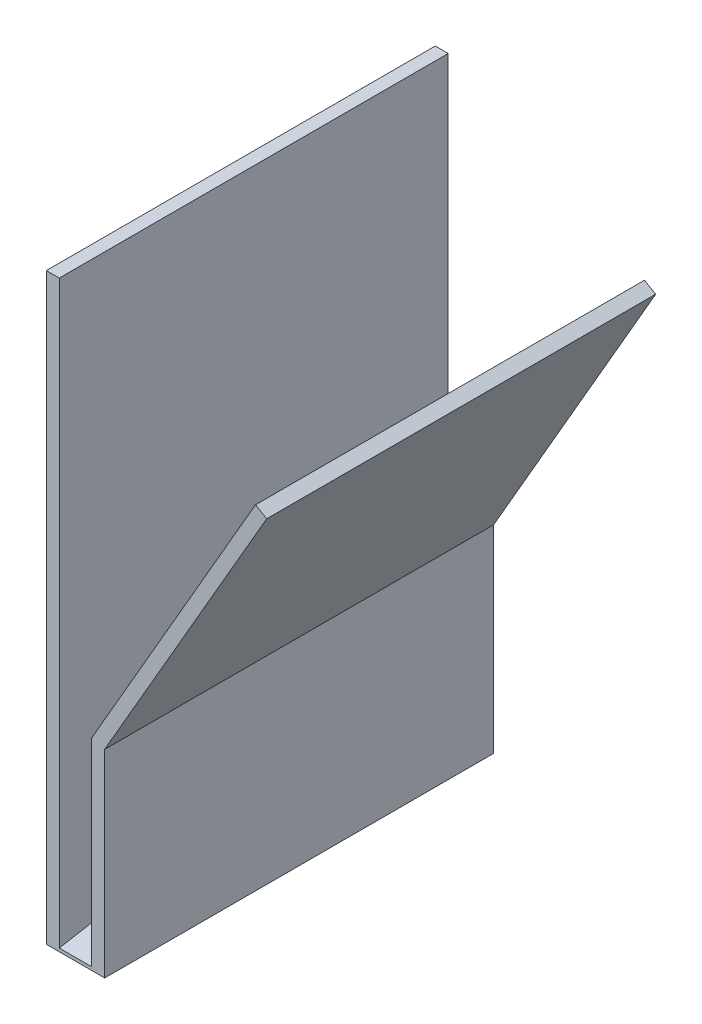
ISO-10303-21;
HEADER;
FILE_DESCRIPTION(('STEP AP214'),'2;1');
FILE_NAME('part.step','',(''),(''),'','','');
FILE_SCHEMA(('AUTOMOTIVE_DESIGN { 1 0 10303 214 1 1 1 1 }'));
ENDSEC;
DATA;
#1=APPLICATION_CONTEXT('core data for automotive mechanical design processes');
#2=APPLICATION_PROTOCOL_DEFINITION('international standard','automotive_design',2000,#1);
#3=PRODUCT_CONTEXT('',#1,'mechanical');
#4=PRODUCT('Part','Part','',(#3));
#5=PRODUCT_RELATED_PRODUCT_CATEGORY('part','',(#4));
#6=PRODUCT_DEFINITION_FORMATION('','',#4);
#7=PRODUCT_DEFINITION_CONTEXT('part definition',#1,'design');
#8=PRODUCT_DEFINITION('design','',#6,#7);
#9=PRODUCT_DEFINITION_SHAPE('','',#8);
#10=(LENGTH_UNIT() NAMED_UNIT(*) SI_UNIT(.MILLI.,.METRE.));
#11=(NAMED_UNIT(*) PLANE_ANGLE_UNIT() SI_UNIT($,.RADIAN.));
#12=(NAMED_UNIT(*) SI_UNIT($,.STERADIAN.) SOLID_ANGLE_UNIT());
#13=UNCERTAINTY_MEASURE_WITH_UNIT(LENGTH_MEASURE(1.E-05),#10,'distance_accuracy_value','');
#14=(GEOMETRIC_REPRESENTATION_CONTEXT(3) GLOBAL_UNCERTAINTY_ASSIGNED_CONTEXT((#13)) GLOBAL_UNIT_ASSIGNED_CONTEXT((#10,
#11,#12)) REPRESENTATION_CONTEXT('',''));
#15=CARTESIAN_POINT('',(0.,0.,0.));
#16=DIRECTION('',(0.,0.,1.));
#17=DIRECTION('',(1.,0.,0.));
#18=AXIS2_PLACEMENT_3D('',#15,#16,#17);
#19=CARTESIAN_POINT('',(4.,0.,120.));
#20=DIRECTION('',(-1.,0.,0.));
#21=DIRECTION('',(0.,0.,1.));
#22=AXIS2_PLACEMENT_3D('',#19,#20,#21);
#23=PLANE('',#22);
#24=DIRECTION('',(0.,-0.173648177666924,0.984807753012209));
#25=VECTOR('',#24,1.);
#26=CARTESIAN_POINT('',(4.,1.,120.));
#27=LINE('',#26,#25);
#28=CARTESIAN_POINT('',(4.,22.159237685015,0.));
#29=VERTEX_POINT('',#28);
#30=CARTESIAN_POINT('',(4.,1.,120.));
#31=VERTEX_POINT('',#30);
#32=EDGE_CURVE('E54',#29,#31,#27,.T.);
#33=ORIENTED_EDGE('',*,*,#32,.F.);
#34=DIRECTION('',(0.,1.,0.));
#35=VECTOR('',#34,1.);
#36=CARTESIAN_POINT('',(4.,0.,0.));
#37=LINE('',#36,#35);
#38=CARTESIAN_POINT('',(4.,180.,0.));
#39=VERTEX_POINT('',#38);
#40=EDGE_CURVE('E192',#29,#39,#37,.T.);
#41=ORIENTED_EDGE('',*,*,#40,.T.);
#42=DIRECTION('',(0.,0.,-1.));
#43=VECTOR('',#42,1.);
#44=CARTESIAN_POINT('',(4.,180.,120.));
#45=LINE('',#44,#43);
#46=CARTESIAN_POINT('',(4.,180.,120.));
#47=VERTEX_POINT('',#46);
#48=EDGE_CURVE('E47',#47,#39,#45,.T.);
#49=ORIENTED_EDGE('',*,*,#48,.F.);
#50=DIRECTION('',(0.,1.,0.));
#51=VECTOR('',#50,1.);
#52=CARTESIAN_POINT('',(4.,0.,120.));
#53=LINE('',#52,#51);
#54=EDGE_CURVE('E184',#31,#47,#53,.T.);
#55=ORIENTED_EDGE('',*,*,#54,.F.);
#56=EDGE_LOOP('',(#33,#41,#49,#55));
#57=FACE_BOUND('',#56,.T.);
#58=ADVANCED_FACE('F39',(#57),#23,.F.);
#59=CARTESIAN_POINT('',(0.,0.,120.));
#60=DIRECTION('',(1.,0.,0.));
#61=DIRECTION('',(0.,0.,-1.));
#62=AXIS2_PLACEMENT_3D('',#59,#60,#61);
#63=PLANE('',#62);
#64=DIRECTION('',(0.,-1.,0.));
#65=VECTOR('',#64,1.);
#66=CARTESIAN_POINT('',(0.,0.,0.));
#67=LINE('',#66,#65);
#68=CARTESIAN_POINT('',(0.,180.,0.));
#69=VERTEX_POINT('',#68);
#70=CARTESIAN_POINT('',(0.,0.,0.));
#71=VERTEX_POINT('',#70);
#72=EDGE_CURVE('E180',#69,#71,#67,.T.);
#73=ORIENTED_EDGE('',*,*,#72,.T.);
#74=DIRECTION('',(0.,0.,-1.));
#75=VECTOR('',#74,1.);
#76=CARTESIAN_POINT('',(0.,0.,120.));
#77=LINE('',#76,#75);
#78=CARTESIAN_POINT('',(0.,0.,120.));
#79=VERTEX_POINT('',#78);
#80=EDGE_CURVE('E11',#79,#71,#77,.T.);
#81=ORIENTED_EDGE('',*,*,#80,.F.);
#82=DIRECTION('',(0.,-1.,0.));
#83=VECTOR('',#82,1.);
#84=CARTESIAN_POINT('',(0.,0.,120.));
#85=LINE('',#84,#83);
#86=CARTESIAN_POINT('',(0.,180.,120.));
#87=VERTEX_POINT('',#86);
#88=EDGE_CURVE('E181',#87,#79,#85,.T.);
#89=ORIENTED_EDGE('',*,*,#88,.F.);
#90=DIRECTION('',(0.,0.,-1.));
#91=VECTOR('',#90,1.);
#92=CARTESIAN_POINT('',(0.,180.,120.));
#93=LINE('',#92,#91);
#94=EDGE_CURVE('E187',#87,#69,#93,.T.);
#95=ORIENTED_EDGE('',*,*,#94,.T.);
#96=EDGE_LOOP('',(#73,#81,#89,#95));
#97=FACE_BOUND('',#96,.T.);
#98=ADVANCED_FACE('F41',(#97),#63,.F.);
#99=CARTESIAN_POINT('',(0.,0.,120.));
#100=DIRECTION('',(0.,1.,0.));
#101=DIRECTION('',(0.,0.,1.));
#102=AXIS2_PLACEMENT_3D('',#99,#100,#101);
#103=PLANE('',#102);
#104=DIRECTION('',(1.,0.,0.));
#105=VECTOR('',#104,1.);
#106=CARTESIAN_POINT('',(0.,0.,0.));
#107=LINE('',#106,#105);
#108=CARTESIAN_POINT('',(18.,0.,0.));
#109=VERTEX_POINT('',#108);
#110=EDGE_CURVE('E190',#71,#109,#107,.T.);
#111=ORIENTED_EDGE('',*,*,#110,.T.);
#112=DIRECTION('',(0.,0.,-1.));
#113=VECTOR('',#112,1.);
#114=CARTESIAN_POINT('',(18.,0.,279.132305016042));
#115=LINE('',#114,#113);
#116=CARTESIAN_POINT('',(18.,0.,120.));
#117=VERTEX_POINT('',#116);
#118=EDGE_CURVE('E162',#117,#109,#115,.T.);
#119=ORIENTED_EDGE('',*,*,#118,.F.);
#120=DIRECTION('',(1.,0.,0.));
#121=VECTOR('',#120,1.);
#122=CARTESIAN_POINT('',(0.,0.,120.));
#123=LINE('',#122,#121);
#124=EDGE_CURVE('E85',#79,#117,#123,.T.);
#125=ORIENTED_EDGE('',*,*,#124,.F.);
#126=ORIENTED_EDGE('',*,*,#80,.T.);
#127=EDGE_LOOP('',(#111,#119,#125,#126));
#128=FACE_BOUND('',#127,.T.);
#129=ADVANCED_FACE('F208',(#128),#103,.F.);
#130=CARTESIAN_POINT('',(0.,180.,120.));
#131=DIRECTION('',(0.,-1.,0.));
#132=DIRECTION('',(0.,0.,-1.));
#133=AXIS2_PLACEMENT_3D('',#130,#131,#132);
#134=PLANE('',#133);
#135=DIRECTION('',(-1.,0.,0.));
#136=VECTOR('',#135,1.);
#137=CARTESIAN_POINT('',(0.,180.,0.));
#138=LINE('',#137,#136);
#139=EDGE_CURVE('E79',#39,#69,#138,.T.);
#140=ORIENTED_EDGE('',*,*,#139,.T.);
#141=ORIENTED_EDGE('',*,*,#94,.F.);
#142=DIRECTION('',(-1.,0.,0.));
#143=VECTOR('',#142,1.);
#144=CARTESIAN_POINT('',(0.,180.,120.));
#145=LINE('',#144,#143);
#146=EDGE_CURVE('E63',#47,#87,#145,.T.);
#147=ORIENTED_EDGE('',*,*,#146,.F.);
#148=ORIENTED_EDGE('',*,*,#48,.T.);
#149=EDGE_LOOP('',(#140,#141,#147,#148));
#150=FACE_BOUND('',#149,.T.);
#151=ADVANCED_FACE('F196',(#150),#134,.F.);
#152=CARTESIAN_POINT('',(0.,0.,120.));
#153=DIRECTION('',(0.,0.,-1.));
#154=DIRECTION('',(-1.,0.,0.));
#155=AXIS2_PLACEMENT_3D('',#152,#153,#154);
#156=PLANE('',#155);
#157=ORIENTED_EDGE('',*,*,#88,.T.);
#158=ORIENTED_EDGE('',*,*,#124,.T.);
#159=DIRECTION('',(0.,1.,0.));
#160=VECTOR('',#159,1.);
#161=CARTESIAN_POINT('',(18.,61.0874409152905,120.));
#162=LINE('',#161,#160);
#163=CARTESIAN_POINT('',(18.,61.0874409152905,120.));
#164=VERTEX_POINT('',#163);
#165=EDGE_CURVE('E172',#117,#164,#162,.T.);
#166=ORIENTED_EDGE('',*,*,#165,.T.);
#167=DIRECTION('',(0.500000000000001,0.866025403784438,0.));
#168=VECTOR('',#167,1.);
#169=CARTESIAN_POINT('',(68.0000000000001,147.689981293734,120.));
#170=LINE('',#169,#168);
#171=CARTESIAN_POINT('',(68.0000000000001,147.689981293734,120.));
#172=VERTEX_POINT('',#171);
#173=EDGE_CURVE('E207',#164,#172,#170,.T.);
#174=ORIENTED_EDGE('',*,*,#173,.T.);
#175=DIRECTION('',(-0.866025403784439,0.5,0.));
#176=VECTOR('',#175,1.);
#177=CARTESIAN_POINT('',(64.5358983848624,149.689981293734,120.));
#178=LINE('',#177,#176);
#179=CARTESIAN_POINT('',(64.5358983848624,149.689981293734,120.));
#180=VERTEX_POINT('',#179);
#181=EDGE_CURVE('E354',#172,#180,#178,.T.);
#182=ORIENTED_EDGE('',*,*,#181,.T.);
#183=DIRECTION('',(-0.500000000000001,-0.866025403784438,0.));
#184=VECTOR('',#183,1.);
#185=CARTESIAN_POINT('',(14.,62.159237685015,120.));
#186=LINE('',#185,#184);
#187=CARTESIAN_POINT('',(14.,62.159237685015,120.));
#188=VERTEX_POINT('',#187);
#189=EDGE_CURVE('E165',#180,#188,#186,.T.);
#190=ORIENTED_EDGE('',*,*,#189,.T.);
#191=DIRECTION('',(0.,-1.,0.));
#192=VECTOR('',#191,1.);
#193=CARTESIAN_POINT('',(14.,0.,120.));
#194=LINE('',#193,#192);
#195=CARTESIAN_POINT('',(14.,1.,120.));
#196=VERTEX_POINT('',#195);
#197=EDGE_CURVE('E143',#188,#196,#194,.T.);
#198=ORIENTED_EDGE('',*,*,#197,.T.);
#199=DIRECTION('',(-1.,0.,0.));
#200=VECTOR('',#199,1.);
#201=CARTESIAN_POINT('',(14.,1.,120.));
#202=LINE('',#201,#200);
#203=EDGE_CURVE('E175',#196,#31,#202,.T.);
#204=ORIENTED_EDGE('',*,*,#203,.T.);
#205=ORIENTED_EDGE('',*,*,#54,.T.);
#206=ORIENTED_EDGE('',*,*,#146,.T.);
#207=EDGE_LOOP('',(#157,#158,#166,#174,#182,#190,#198,#204,#205,#206));
#208=FACE_BOUND('',#207,.T.);
#209=ADVANCED_FACE('F200',(#208),#156,.F.);
#210=CARTESIAN_POINT('',(0.,0.,0.));
#211=DIRECTION('',(0.,0.,-1.));
#212=DIRECTION('',(-1.,0.,0.));
#213=AXIS2_PLACEMENT_3D('',#210,#211,#212);
#214=PLANE('',#213);
#215=ORIENTED_EDGE('',*,*,#72,.F.);
#216=ORIENTED_EDGE('',*,*,#139,.F.);
#217=ORIENTED_EDGE('',*,*,#40,.F.);
#218=DIRECTION('',(-1.,0.,0.));
#219=VECTOR('',#218,1.);
#220=CARTESIAN_POINT('',(14.,22.159237685015,0.));
#221=LINE('',#220,#219);
#222=CARTESIAN_POINT('',(14.,22.159237685015,0.));
#223=VERTEX_POINT('',#222);
#224=EDGE_CURVE('E133',#223,#29,#221,.T.);
#225=ORIENTED_EDGE('',*,*,#224,.F.);
#226=DIRECTION('',(0.,1.,0.));
#227=VECTOR('',#226,1.);
#228=CARTESIAN_POINT('',(14.,0.,0.));
#229=LINE('',#228,#227);
#230=CARTESIAN_POINT('',(14.,62.159237685015,0.));
#231=VERTEX_POINT('',#230);
#232=EDGE_CURVE('E125',#223,#231,#229,.T.);
#233=ORIENTED_EDGE('',*,*,#232,.T.);
#234=DIRECTION('',(0.500000000000001,0.866025403784438,0.));
#235=VECTOR('',#234,1.);
#236=CARTESIAN_POINT('',(14.,62.159237685015,0.));
#237=LINE('',#236,#235);
#238=CARTESIAN_POINT('',(64.5358983848624,149.689981293734,0.));
#239=VERTEX_POINT('',#238);
#240=EDGE_CURVE('E131',#231,#239,#237,.T.);
#241=ORIENTED_EDGE('',*,*,#240,.T.);
#242=DIRECTION('',(0.866025403784439,-0.5,0.));
#243=VECTOR('',#242,1.);
#244=CARTESIAN_POINT('',(64.5358983848624,149.689981293734,0.));
#245=LINE('',#244,#243);
#246=CARTESIAN_POINT('',(68.0000000000001,147.689981293734,0.));
#247=VERTEX_POINT('',#246);
#248=EDGE_CURVE('E152',#239,#247,#245,.T.);
#249=ORIENTED_EDGE('',*,*,#248,.T.);
#250=DIRECTION('',(-0.500000000000001,-0.866025403784438,0.));
#251=VECTOR('',#250,1.);
#252=CARTESIAN_POINT('',(68.0000000000001,147.689981293734,0.));
#253=LINE('',#252,#251);
#254=CARTESIAN_POINT('',(18.,61.0874409152905,0.));
#255=VERTEX_POINT('',#254);
#256=EDGE_CURVE('E154',#247,#255,#253,.T.);
#257=ORIENTED_EDGE('',*,*,#256,.T.);
#258=DIRECTION('',(0.,-1.,0.));
#259=VECTOR('',#258,1.);
#260=CARTESIAN_POINT('',(18.,61.0874409152905,0.));
#261=LINE('',#260,#259);
#262=EDGE_CURVE('E147',#255,#109,#261,.T.);
#263=ORIENTED_EDGE('',*,*,#262,.T.);
#264=ORIENTED_EDGE('',*,*,#110,.F.);
#265=EDGE_LOOP('',(#215,#216,#217,#225,#233,#241,#249,#257,#263,#264));
#266=FACE_BOUND('',#265,.T.);
#267=ADVANCED_FACE('F128',(#266),#214,.T.);
#268=CARTESIAN_POINT('',(14.,1.,120.));
#269=DIRECTION('',(0.,-0.984807753012209,-0.173648177666924));
#270=DIRECTION('',(0.,0.173648177666924,-0.984807753012209));
#271=AXIS2_PLACEMENT_3D('',#268,#269,#270);
#272=PLANE('',#271);
#273=ORIENTED_EDGE('',*,*,#32,.T.);
#274=ORIENTED_EDGE('',*,*,#203,.F.);
#275=DIRECTION('',(0.,-0.173648177666924,0.984807753012209));
#276=VECTOR('',#275,1.);
#277=CARTESIAN_POINT('',(14.,1.,120.));
#278=LINE('',#277,#276);
#279=EDGE_CURVE('E173',#223,#196,#278,.T.);
#280=ORIENTED_EDGE('',*,*,#279,.F.);
#281=ORIENTED_EDGE('',*,*,#224,.T.);
#282=EDGE_LOOP('',(#273,#274,#280,#281));
#283=FACE_BOUND('',#282,.T.);
#284=ADVANCED_FACE('F222',(#283),#272,.F.);
#285=CARTESIAN_POINT('',(18.,61.0874409152905,279.132305016042));
#286=DIRECTION('',(1.,0.,0.));
#287=DIRECTION('',(0.,0.,-1.));
#288=AXIS2_PLACEMENT_3D('',#285,#286,#287);
#289=PLANE('',#288);
#290=ORIENTED_EDGE('',*,*,#165,.F.);
#291=ORIENTED_EDGE('',*,*,#118,.T.);
#292=ORIENTED_EDGE('',*,*,#262,.F.);
#293=DIRECTION('',(0.,0.,-1.));
#294=VECTOR('',#293,1.);
#295=CARTESIAN_POINT('',(18.,61.0874409152905,279.132305016042));
#296=LINE('',#295,#294);
#297=EDGE_CURVE('E166',#164,#255,#296,.T.);
#298=ORIENTED_EDGE('',*,*,#297,.F.);
#299=EDGE_LOOP('',(#290,#291,#292,#298));
#300=FACE_BOUND('',#299,.T.);
#301=ADVANCED_FACE('F205',(#300),#289,.T.);
#302=CARTESIAN_POINT('',(68.0000000000001,147.689981293734,279.132305016042));
#303=DIRECTION('',(0.866025403784438,-0.500000000000001,0.));
#304=DIRECTION('',(0.500000000000001,0.866025403784438,0.));
#305=AXIS2_PLACEMENT_3D('',#302,#303,#304);
#306=PLANE('',#305);
#307=ORIENTED_EDGE('',*,*,#173,.F.);
#308=ORIENTED_EDGE('',*,*,#297,.T.);
#309=ORIENTED_EDGE('',*,*,#256,.F.);
#310=DIRECTION('',(0.,0.,-1.));
#311=VECTOR('',#310,1.);
#312=CARTESIAN_POINT('',(68.0000000000001,147.689981293734,279.132305016042));
#313=LINE('',#312,#311);
#314=EDGE_CURVE('E168',#172,#247,#313,.T.);
#315=ORIENTED_EDGE('',*,*,#314,.F.);
#316=EDGE_LOOP('',(#307,#308,#309,#315));
#317=FACE_BOUND('',#316,.T.);
#318=ADVANCED_FACE('F235',(#317),#306,.T.);
#319=CARTESIAN_POINT('',(64.5358983848624,149.689981293734,279.132305016042));
#320=DIRECTION('',(0.5,0.866025403784439,0.));
#321=DIRECTION('',(-0.866025403784439,0.5,0.));
#322=AXIS2_PLACEMENT_3D('',#319,#320,#321);
#323=PLANE('',#322);
#324=ORIENTED_EDGE('',*,*,#181,.F.);
#325=ORIENTED_EDGE('',*,*,#314,.T.);
#326=ORIENTED_EDGE('',*,*,#248,.F.);
#327=DIRECTION('',(0.,0.,-1.));
#328=VECTOR('',#327,1.);
#329=CARTESIAN_POINT('',(64.5358983848624,149.689981293734,279.132305016042));
#330=LINE('',#329,#328);
#331=EDGE_CURVE('E146',#180,#239,#330,.T.);
#332=ORIENTED_EDGE('',*,*,#331,.F.);
#333=EDGE_LOOP('',(#324,#325,#326,#332));
#334=FACE_BOUND('',#333,.T.);
#335=ADVANCED_FACE('F232',(#334),#323,.T.);
#336=CARTESIAN_POINT('',(14.,62.159237685015,279.132305016042));
#337=DIRECTION('',(-0.866025403784438,0.500000000000001,0.));
#338=DIRECTION('',(-0.500000000000001,-0.866025403784438,0.));
#339=AXIS2_PLACEMENT_3D('',#336,#337,#338);
#340=PLANE('',#339);
#341=ORIENTED_EDGE('',*,*,#189,.F.);
#342=ORIENTED_EDGE('',*,*,#331,.T.);
#343=ORIENTED_EDGE('',*,*,#240,.F.);
#344=DIRECTION('',(0.,0.,-1.));
#345=VECTOR('',#344,1.);
#346=CARTESIAN_POINT('',(14.,62.159237685015,279.132305016042));
#347=LINE('',#346,#345);
#348=EDGE_CURVE('E140',#188,#231,#347,.T.);
#349=ORIENTED_EDGE('',*,*,#348,.F.);
#350=EDGE_LOOP('',(#341,#342,#343,#349));
#351=FACE_BOUND('',#350,.T.);
#352=ADVANCED_FACE('F149',(#351),#340,.T.);
#353=CARTESIAN_POINT('',(14.,0.,279.132305016042));
#354=DIRECTION('',(-1.,0.,0.));
#355=DIRECTION('',(0.,0.,1.));
#356=AXIS2_PLACEMENT_3D('',#353,#354,#355);
#357=PLANE('',#356);
#358=ORIENTED_EDGE('',*,*,#232,.F.);
#359=ORIENTED_EDGE('',*,*,#279,.T.);
#360=ORIENTED_EDGE('',*,*,#197,.F.);
#361=ORIENTED_EDGE('',*,*,#348,.T.);
#362=EDGE_LOOP('',(#358,#359,#360,#361));
#363=FACE_BOUND('',#362,.T.);
#364=ADVANCED_FACE('F141',(#363),#357,.T.);
#365=CLOSED_SHELL('',(#58,#98,#129,#151,#209,#267,#284,#301,#318,#335,#352,#364));
#366=MANIFOLD_SOLID_BREP('B2',#365);
#367=ADVANCED_BREP_SHAPE_REPRESENTATION('',(#18,#366),#14);
#368=SHAPE_DEFINITION_REPRESENTATION(#9,#367);
ENDSEC;
END-ISO-10303-21;
